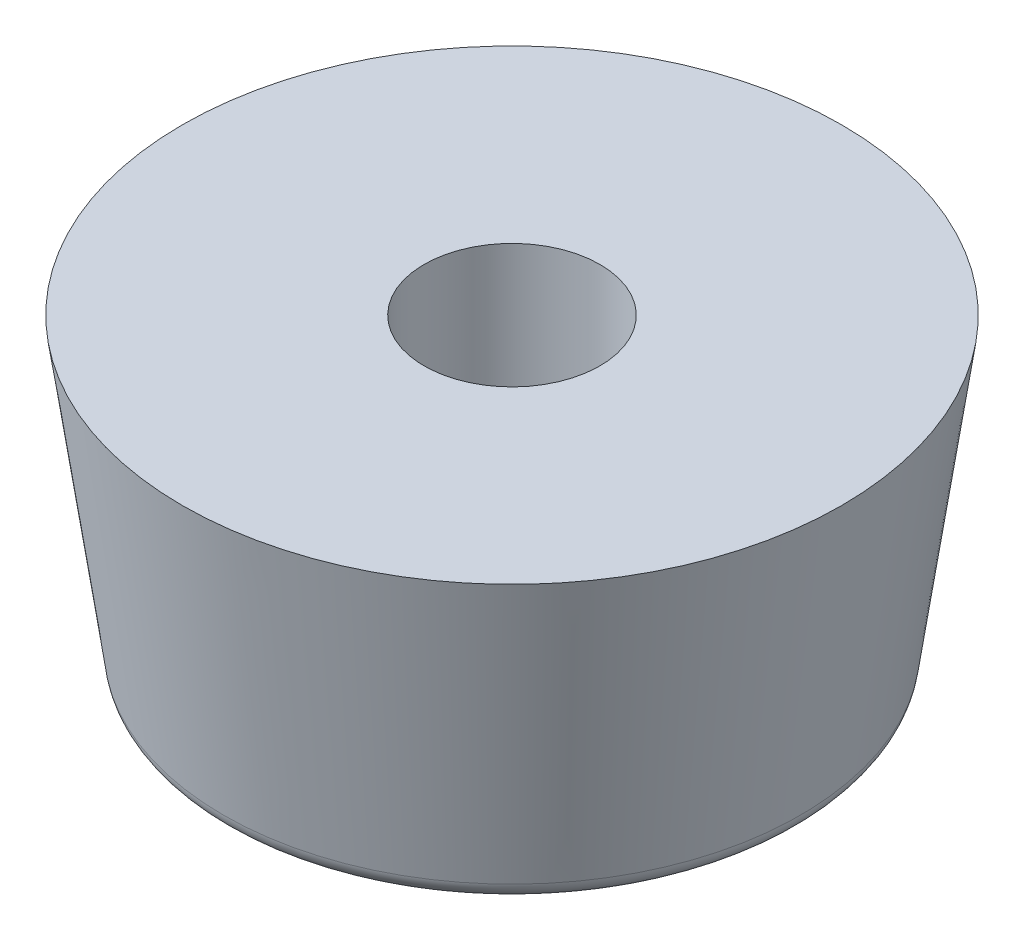
ISO-10303-21;
HEADER;
FILE_DESCRIPTION(('STEP AP214'),'2;1');
FILE_NAME('part.step','',(''),(''),'','','');
FILE_SCHEMA(('AUTOMOTIVE_DESIGN { 1 0 10303 214 1 1 1 1 }'));
ENDSEC;
DATA;
#1=APPLICATION_CONTEXT('core data for automotive mechanical design processes');
#2=APPLICATION_PROTOCOL_DEFINITION('international standard','automotive_design',2000,#1);
#3=PRODUCT_CONTEXT('',#1,'mechanical');
#4=PRODUCT('Part','Part','',(#3));
#5=PRODUCT_RELATED_PRODUCT_CATEGORY('part','',(#4));
#6=PRODUCT_DEFINITION_FORMATION('','',#4);
#7=PRODUCT_DEFINITION_CONTEXT('part definition',#1,'design');
#8=PRODUCT_DEFINITION('design','',#6,#7);
#9=PRODUCT_DEFINITION_SHAPE('','',#8);
#10=(LENGTH_UNIT() NAMED_UNIT(*) SI_UNIT(.MILLI.,.METRE.));
#11=(NAMED_UNIT(*) PLANE_ANGLE_UNIT() SI_UNIT($,.RADIAN.));
#12=(NAMED_UNIT(*) SI_UNIT($,.STERADIAN.) SOLID_ANGLE_UNIT());
#13=UNCERTAINTY_MEASURE_WITH_UNIT(LENGTH_MEASURE(1.E-05),#10,'distance_accuracy_value','');
#14=(GEOMETRIC_REPRESENTATION_CONTEXT(3) GLOBAL_UNCERTAINTY_ASSIGNED_CONTEXT((#13)) GLOBAL_UNIT_ASSIGNED_CONTEXT((#10,
#11,#12)) REPRESENTATION_CONTEXT('',''));
#15=CARTESIAN_POINT('',(0.,0.,0.));
#16=DIRECTION('',(0.,0.,1.));
#17=DIRECTION('',(1.,0.,0.));
#18=AXIS2_PLACEMENT_3D('',#15,#16,#17);
#19=CARTESIAN_POINT('',(0.,0.,0.));
#20=DIRECTION('',(0.,-1.,0.));
#21=DIRECTION('',(0.,0.,-1.));
#22=AXIS2_PLACEMENT_3D('',#19,#20,#21);
#23=CYLINDRICAL_SURFACE('',#22,2.);
#24=CARTESIAN_POINT('',(0.,3.27,0.));
#25=DIRECTION('',(0.,-1.,0.));
#26=DIRECTION('',(0.,0.,-1.));
#27=AXIS2_PLACEMENT_3D('',#24,#25,#26);
#28=CIRCLE('',#27,2.);
#29=CARTESIAN_POINT('',(0.,3.27,-2.));
#30=VERTEX_POINT('',#29);
#31=EDGE_CURVE('E60',#30,#30,#28,.T.);
#32=ORIENTED_EDGE('',*,*,#31,.T.);
#33=EDGE_LOOP('',(#32));
#34=FACE_BOUND('',#33,.T.);
#35=CARTESIAN_POINT('',(0.,7.,0.));
#36=DIRECTION('',(0.,-1.,0.));
#37=DIRECTION('',(0.,0.,-1.));
#38=AXIS2_PLACEMENT_3D('',#35,#36,#37);
#39=CIRCLE('',#38,2.);
#40=CARTESIAN_POINT('',(0.,7.,-2.));
#41=VERTEX_POINT('',#40);
#42=EDGE_CURVE('E51',#41,#41,#39,.T.);
#43=ORIENTED_EDGE('',*,*,#42,.F.);
#44=EDGE_LOOP('',(#43));
#45=FACE_BOUND('',#44,.T.);
#46=ADVANCED_FACE('F31',(#34,#45),#23,.F.);
#47=CARTESIAN_POINT('',(2.,7.,0.));
#48=DIRECTION('',(0.,1.,0.));
#49=DIRECTION('',(0.,0.,1.));
#50=AXIS2_PLACEMENT_3D('',#47,#48,#49);
#51=PLANE('',#50);
#52=ORIENTED_EDGE('',*,*,#42,.T.);
#53=EDGE_LOOP('',(#52));
#54=FACE_BOUND('',#53,.T.);
#55=CARTESIAN_POINT('',(0.,7.,0.));
#56=DIRECTION('',(0.,-1.,0.));
#57=DIRECTION('',(0.,0.,-1.));
#58=AXIS2_PLACEMENT_3D('',#55,#56,#57);
#59=CIRCLE('',#58,7.5);
#60=CARTESIAN_POINT('',(0.,7.,-7.5));
#61=VERTEX_POINT('',#60);
#62=EDGE_CURVE('E54',#61,#61,#59,.T.);
#63=ORIENTED_EDGE('',*,*,#62,.F.);
#64=EDGE_LOOP('',(#63));
#65=FACE_BOUND('',#64,.T.);
#66=ADVANCED_FACE('F81',(#54,#65),#51,.T.);
#67=CARTESIAN_POINT('',(0.,0.,0.));
#68=DIRECTION('',(0.,1.,0.));
#69=DIRECTION('',(0.,0.,1.));
#70=AXIS2_PLACEMENT_3D('',#67,#68,#69);
#71=CONICAL_SURFACE('',#70,6.5,0.141897054604164);
#72=CARTESIAN_POINT('',(0.,0.429289321881354,0.));
#73=DIRECTION('',(0.,-1.,0.));
#74=DIRECTION('',(0.,0.,-1.));
#75=AXIS2_PLACEMENT_3D('',#72,#73,#74);
#76=CIRCLE('',#75,6.56132704598305);
#77=CARTESIAN_POINT('',(0.,0.429289321881354,-6.56132704598305));
#78=VERTEX_POINT('',#77);
#79=EDGE_CURVE('E10',#78,#78,#76,.F.);
#80=ORIENTED_EDGE('',*,*,#79,.T.);
#81=EDGE_LOOP('',(#80));
#82=FACE_BOUND('',#81,.T.);
#83=ORIENTED_EDGE('',*,*,#62,.T.);
#84=EDGE_LOOP('',(#83));
#85=FACE_BOUND('',#84,.T.);
#86=ADVANCED_FACE('F86',(#82,#85),#71,.T.);
#87=CARTESIAN_POINT('',(6.5,0.,0.));
#88=DIRECTION('',(0.,-1.,0.));
#89=DIRECTION('',(0.,0.,-1.));
#90=AXIS2_PLACEMENT_3D('',#87,#88,#89);
#91=PLANE('',#90);
#92=CARTESIAN_POINT('',(0.,0.,0.));
#93=DIRECTION('',(0.,-1.,0.));
#94=DIRECTION('',(0.,0.,-1.));
#95=AXIS2_PLACEMENT_3D('',#92,#93,#94);
#96=CIRCLE('',#95,4.);
#97=CARTESIAN_POINT('',(0.,0.,-4.));
#98=VERTEX_POINT('',#97);
#99=EDGE_CURVE('E38',#98,#98,#96,.F.);
#100=ORIENTED_EDGE('',*,*,#99,.T.);
#101=EDGE_LOOP('',(#100));
#102=FACE_BOUND('',#101,.T.);
#103=CARTESIAN_POINT('',(0.,0.,0.));
#104=DIRECTION('',(0.,-1.,0.));
#105=DIRECTION('',(0.,0.,-1.));
#106=AXIS2_PLACEMENT_3D('',#103,#104,#105);
#107=CIRCLE('',#106,6.06635229915247);
#108=CARTESIAN_POINT('',(0.,0.,-6.06635229915247));
#109=VERTEX_POINT('',#108);
#110=EDGE_CURVE('E42',#109,#109,#107,.T.);
#111=ORIENTED_EDGE('',*,*,#110,.T.);
#112=EDGE_LOOP('',(#111));
#113=FACE_BOUND('',#112,.T.);
#114=ADVANCED_FACE('F77',(#102,#113),#91,.T.);
#115=CARTESIAN_POINT('',(0.,0.,0.));
#116=DIRECTION('',(0.,-1.,0.));
#117=DIRECTION('',(0.,0.,-1.));
#118=AXIS2_PLACEMENT_3D('',#115,#116,#117);
#119=CYLINDRICAL_SURFACE('',#118,3.5);
#120=CARTESIAN_POINT('',(0.,0.5,0.));
#121=DIRECTION('',(0.,-1.,0.));
#122=DIRECTION('',(0.,0.,-1.));
#123=AXIS2_PLACEMENT_3D('',#120,#121,#122);
#124=CIRCLE('',#123,3.5);
#125=CARTESIAN_POINT('',(0.,0.5,-3.5));
#126=VERTEX_POINT('',#125);
#127=EDGE_CURVE('E46',#126,#126,#124,.T.);
#128=ORIENTED_EDGE('',*,*,#127,.T.);
#129=EDGE_LOOP('',(#128));
#130=FACE_BOUND('',#129,.T.);
#131=CARTESIAN_POINT('',(0.,3.27,0.));
#132=DIRECTION('',(0.,-1.,0.));
#133=DIRECTION('',(0.,0.,-1.));
#134=AXIS2_PLACEMENT_3D('',#131,#132,#133);
#135=CIRCLE('',#134,3.5);
#136=CARTESIAN_POINT('',(0.,3.27,-3.5));
#137=VERTEX_POINT('',#136);
#138=EDGE_CURVE('E57',#137,#137,#135,.T.);
#139=ORIENTED_EDGE('',*,*,#138,.F.);
#140=EDGE_LOOP('',(#139));
#141=FACE_BOUND('',#140,.T.);
#142=ADVANCED_FACE('F69',(#130,#141),#119,.F.);
#143=CARTESIAN_POINT('',(3.5,3.27,0.));
#144=DIRECTION('',(0.,-1.,0.));
#145=DIRECTION('',(0.,0.,-1.));
#146=AXIS2_PLACEMENT_3D('',#143,#144,#145);
#147=PLANE('',#146);
#148=ORIENTED_EDGE('',*,*,#138,.T.);
#149=EDGE_LOOP('',(#148));
#150=FACE_BOUND('',#149,.T.);
#151=ORIENTED_EDGE('',*,*,#31,.F.);
#152=EDGE_LOOP('',(#151));
#153=FACE_BOUND('',#152,.T.);
#154=ADVANCED_FACE('F66',(#150,#153),#147,.T.);
#155=CARTESIAN_POINT('',(0.,0.5,0.));
#156=DIRECTION('',(0.,-1.,0.));
#157=DIRECTION('',(0.,0.,-1.));
#158=AXIS2_PLACEMENT_3D('',#155,#156,#157);
#159=TOROIDAL_SURFACE('',#158,4.,0.5);
#160=ORIENTED_EDGE('',*,*,#99,.F.);
#161=EDGE_LOOP('',(#160));
#162=FACE_BOUND('',#161,.T.);
#163=ORIENTED_EDGE('',*,*,#127,.F.);
#164=EDGE_LOOP('',(#163));
#165=FACE_BOUND('',#164,.T.);
#166=ADVANCED_FACE('F68',(#162,#165),#159,.T.);
#167=CARTESIAN_POINT('',(0.,0.5,0.));
#168=DIRECTION('',(0.,-1.,0.));
#169=DIRECTION('',(0.,0.,-1.));
#170=AXIS2_PLACEMENT_3D('',#167,#168,#169);
#171=TOROIDAL_SURFACE('',#170,6.06635229915247,0.5);
#172=ORIENTED_EDGE('',*,*,#79,.F.);
#173=EDGE_LOOP('',(#172));
#174=FACE_BOUND('',#173,.T.);
#175=ORIENTED_EDGE('',*,*,#110,.F.);
#176=EDGE_LOOP('',(#175));
#177=FACE_BOUND('',#176,.T.);
#178=ADVANCED_FACE('F33',(#174,#177),#171,.T.);
#179=CLOSED_SHELL('',(#46,#66,#86,#114,#142,#154,#166,#178));
#180=MANIFOLD_SOLID_BREP('B2',#179);
#181=ADVANCED_BREP_SHAPE_REPRESENTATION('',(#18,#180),#14);
#182=SHAPE_DEFINITION_REPRESENTATION(#9,#181);
ENDSEC;
END-ISO-10303-21;
